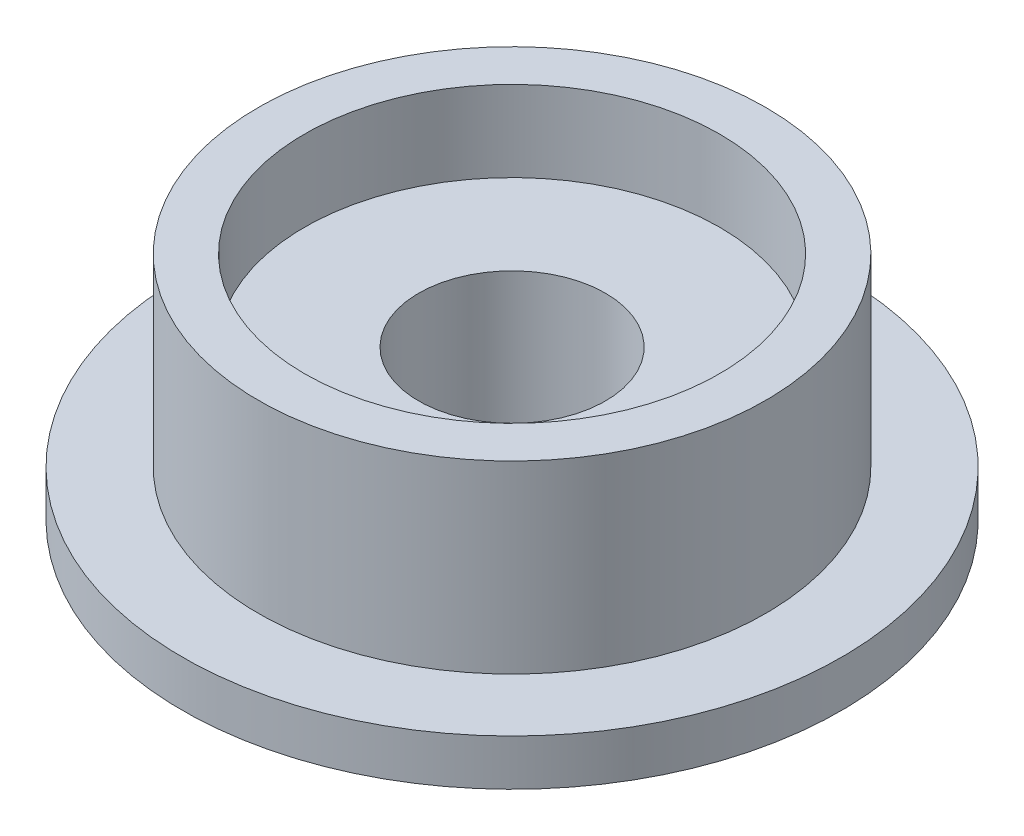
ISO-10303-21;
HEADER;
FILE_DESCRIPTION(('STEP AP214'),'2;1');
FILE_NAME('part.step','',(''),(''),'','','');
FILE_SCHEMA(('AUTOMOTIVE_DESIGN { 1 0 10303 214 1 1 1 1 }'));
ENDSEC;
DATA;
#1=APPLICATION_CONTEXT('core data for automotive mechanical design processes');
#2=APPLICATION_PROTOCOL_DEFINITION('international standard','automotive_design',2000,#1);
#3=PRODUCT_CONTEXT('',#1,'mechanical');
#4=PRODUCT('Part','Part','',(#3));
#5=PRODUCT_RELATED_PRODUCT_CATEGORY('part','',(#4));
#6=PRODUCT_DEFINITION_FORMATION('','',#4);
#7=PRODUCT_DEFINITION_CONTEXT('part definition',#1,'design');
#8=PRODUCT_DEFINITION('design','',#6,#7);
#9=PRODUCT_DEFINITION_SHAPE('','',#8);
#10=(LENGTH_UNIT() NAMED_UNIT(*) SI_UNIT(.MILLI.,.METRE.));
#11=(NAMED_UNIT(*) PLANE_ANGLE_UNIT() SI_UNIT($,.RADIAN.));
#12=(NAMED_UNIT(*) SI_UNIT($,.STERADIAN.) SOLID_ANGLE_UNIT());
#13=UNCERTAINTY_MEASURE_WITH_UNIT(LENGTH_MEASURE(1.E-05),#10,'distance_accuracy_value','');
#14=(GEOMETRIC_REPRESENTATION_CONTEXT(3) GLOBAL_UNCERTAINTY_ASSIGNED_CONTEXT((#13)) GLOBAL_UNIT_ASSIGNED_CONTEXT((#10,
#11,#12)) REPRESENTATION_CONTEXT('',''));
#15=CARTESIAN_POINT('',(0.,0.,0.));
#16=DIRECTION('',(0.,0.,1.));
#17=DIRECTION('',(1.,0.,0.));
#18=AXIS2_PLACEMENT_3D('',#15,#16,#17);
#19=CARTESIAN_POINT('',(4.05,0.,0.));
#20=DIRECTION('',(0.,-1.,0.));
#21=DIRECTION('',(0.,0.,-1.));
#22=AXIS2_PLACEMENT_3D('',#19,#20,#21);
#23=PLANE('',#22);
#24=CARTESIAN_POINT('',(0.,0.,0.));
#25=DIRECTION('',(0.,-1.,0.));
#26=DIRECTION('',(0.,0.,-1.));
#27=AXIS2_PLACEMENT_3D('',#24,#25,#26);
#28=CIRCLE('',#27,14.2875);
#29=CARTESIAN_POINT('',(0.,0.,-14.2875));
#30=VERTEX_POINT('',#29);
#31=EDGE_CURVE('E59',#30,#30,#28,.T.);
#32=ORIENTED_EDGE('',*,*,#31,.T.);
#33=EDGE_LOOP('',(#32));
#34=FACE_BOUND('',#33,.T.);
#35=CARTESIAN_POINT('',(0.,0.,0.));
#36=DIRECTION('',(0.,-1.,0.));
#37=DIRECTION('',(0.,0.,-1.));
#38=AXIS2_PLACEMENT_3D('',#35,#36,#37);
#39=CIRCLE('',#38,4.05);
#40=CARTESIAN_POINT('',(0.,0.,-4.05));
#41=VERTEX_POINT('',#40);
#42=EDGE_CURVE('E10',#41,#41,#39,.T.);
#43=ORIENTED_EDGE('',*,*,#42,.F.);
#44=EDGE_LOOP('',(#43));
#45=FACE_BOUND('',#44,.T.);
#46=ADVANCED_FACE('F31',(#34,#45),#23,.T.);
#47=CARTESIAN_POINT('',(0.,0.,0.));
#48=DIRECTION('',(0.,-1.,0.));
#49=DIRECTION('',(0.,0.,-1.));
#50=AXIS2_PLACEMENT_3D('',#47,#48,#49);
#51=CYLINDRICAL_SURFACE('',#50,4.05);
#52=ORIENTED_EDGE('',*,*,#42,.T.);
#53=EDGE_LOOP('',(#52));
#54=FACE_BOUND('',#53,.T.);
#55=CARTESIAN_POINT('',(0.,6.5,0.));
#56=DIRECTION('',(0.,-1.,0.));
#57=DIRECTION('',(0.,0.,-1.));
#58=AXIS2_PLACEMENT_3D('',#55,#56,#57);
#59=CIRCLE('',#58,4.05);
#60=CARTESIAN_POINT('',(0.,6.5,-4.05));
#61=VERTEX_POINT('',#60);
#62=EDGE_CURVE('E37',#61,#61,#59,.T.);
#63=ORIENTED_EDGE('',*,*,#62,.F.);
#64=EDGE_LOOP('',(#63));
#65=FACE_BOUND('',#64,.T.);
#66=ADVANCED_FACE('F77',(#54,#65),#51,.F.);
#67=CARTESIAN_POINT('',(4.05,6.5,0.));
#68=DIRECTION('',(0.,1.,0.));
#69=DIRECTION('',(0.,0.,1.));
#70=AXIS2_PLACEMENT_3D('',#67,#68,#69);
#71=PLANE('',#70);
#72=ORIENTED_EDGE('',*,*,#62,.T.);
#73=EDGE_LOOP('',(#72));
#74=FACE_BOUND('',#73,.T.);
#75=CARTESIAN_POINT('',(0.,6.5,0.));
#76=DIRECTION('',(0.,-1.,0.));
#77=DIRECTION('',(0.,0.,-1.));
#78=AXIS2_PLACEMENT_3D('',#75,#76,#77);
#79=CIRCLE('',#78,9.);
#80=CARTESIAN_POINT('',(0.,6.5,-9.));
#81=VERTEX_POINT('',#80);
#82=EDGE_CURVE('E41',#81,#81,#79,.T.);
#83=ORIENTED_EDGE('',*,*,#82,.F.);
#84=EDGE_LOOP('',(#83));
#85=FACE_BOUND('',#84,.T.);
#86=ADVANCED_FACE('F81',(#74,#85),#71,.T.);
#87=CARTESIAN_POINT('',(0.,0.,0.));
#88=DIRECTION('',(0.,-1.,0.));
#89=DIRECTION('',(0.,0.,-1.));
#90=AXIS2_PLACEMENT_3D('',#87,#88,#89);
#91=CYLINDRICAL_SURFACE('',#90,9.);
#92=ORIENTED_EDGE('',*,*,#82,.T.);
#93=EDGE_LOOP('',(#92));
#94=FACE_BOUND('',#93,.T.);
#95=CARTESIAN_POINT('',(0.,10.,0.));
#96=DIRECTION('',(0.,-1.,0.));
#97=DIRECTION('',(0.,0.,-1.));
#98=AXIS2_PLACEMENT_3D('',#95,#96,#97);
#99=CIRCLE('',#98,9.);
#100=CARTESIAN_POINT('',(0.,10.,-9.));
#101=VERTEX_POINT('',#100);
#102=EDGE_CURVE('E45',#101,#101,#99,.T.);
#103=ORIENTED_EDGE('',*,*,#102,.F.);
#104=EDGE_LOOP('',(#103));
#105=FACE_BOUND('',#104,.T.);
#106=ADVANCED_FACE('F85',(#94,#105),#91,.F.);
#107=CARTESIAN_POINT('',(9.,10.,0.));
#108=DIRECTION('',(0.,1.,0.));
#109=DIRECTION('',(0.,0.,1.));
#110=AXIS2_PLACEMENT_3D('',#107,#108,#109);
#111=PLANE('',#110);
#112=ORIENTED_EDGE('',*,*,#102,.T.);
#113=EDGE_LOOP('',(#112));
#114=FACE_BOUND('',#113,.T.);
#115=CARTESIAN_POINT('',(0.,10.,0.));
#116=DIRECTION('',(0.,-1.,0.));
#117=DIRECTION('',(0.,0.,-1.));
#118=AXIS2_PLACEMENT_3D('',#115,#116,#117);
#119=CIRCLE('',#118,11.);
#120=CARTESIAN_POINT('',(0.,10.,-11.));
#121=VERTEX_POINT('',#120);
#122=EDGE_CURVE('E50',#121,#121,#119,.T.);
#123=ORIENTED_EDGE('',*,*,#122,.F.);
#124=EDGE_LOOP('',(#123));
#125=FACE_BOUND('',#124,.T.);
#126=ADVANCED_FACE('F91',(#114,#125),#111,.T.);
#127=CARTESIAN_POINT('',(0.,0.,0.));
#128=DIRECTION('',(0.,-1.,0.));
#129=DIRECTION('',(0.,0.,-1.));
#130=AXIS2_PLACEMENT_3D('',#127,#128,#129);
#131=CYLINDRICAL_SURFACE('',#130,11.);
#132=ORIENTED_EDGE('',*,*,#122,.T.);
#133=EDGE_LOOP('',(#132));
#134=FACE_BOUND('',#133,.T.);
#135=CARTESIAN_POINT('',(0.,2.,0.));
#136=DIRECTION('',(0.,-1.,0.));
#137=DIRECTION('',(0.,0.,-1.));
#138=AXIS2_PLACEMENT_3D('',#135,#136,#137);
#139=CIRCLE('',#138,11.);
#140=CARTESIAN_POINT('',(0.,2.,-11.));
#141=VERTEX_POINT('',#140);
#142=EDGE_CURVE('E53',#141,#141,#139,.T.);
#143=ORIENTED_EDGE('',*,*,#142,.F.);
#144=EDGE_LOOP('',(#143));
#145=FACE_BOUND('',#144,.T.);
#146=ADVANCED_FACE('F73',(#134,#145),#131,.T.);
#147=CARTESIAN_POINT('',(11.,2.,0.));
#148=DIRECTION('',(0.,1.,0.));
#149=DIRECTION('',(0.,0.,1.));
#150=AXIS2_PLACEMENT_3D('',#147,#148,#149);
#151=PLANE('',#150);
#152=ORIENTED_EDGE('',*,*,#142,.T.);
#153=EDGE_LOOP('',(#152));
#154=FACE_BOUND('',#153,.T.);
#155=CARTESIAN_POINT('',(0.,2.,0.));
#156=DIRECTION('',(0.,-1.,0.));
#157=DIRECTION('',(0.,0.,-1.));
#158=AXIS2_PLACEMENT_3D('',#155,#156,#157);
#159=CIRCLE('',#158,14.2875);
#160=CARTESIAN_POINT('',(0.,2.,-14.2875));
#161=VERTEX_POINT('',#160);
#162=EDGE_CURVE('E56',#161,#161,#159,.T.);
#163=ORIENTED_EDGE('',*,*,#162,.F.);
#164=EDGE_LOOP('',(#163));
#165=FACE_BOUND('',#164,.T.);
#166=ADVANCED_FACE('F67',(#154,#165),#151,.T.);
#167=CARTESIAN_POINT('',(0.,0.,0.));
#168=DIRECTION('',(0.,-1.,0.));
#169=DIRECTION('',(0.,0.,-1.));
#170=AXIS2_PLACEMENT_3D('',#167,#168,#169);
#171=CYLINDRICAL_SURFACE('',#170,14.2875);
#172=ORIENTED_EDGE('',*,*,#162,.T.);
#173=EDGE_LOOP('',(#172));
#174=FACE_BOUND('',#173,.T.);
#175=ORIENTED_EDGE('',*,*,#31,.F.);
#176=EDGE_LOOP('',(#175));
#177=FACE_BOUND('',#176,.T.);
#178=ADVANCED_FACE('F65',(#174,#177),#171,.T.);
#179=CLOSED_SHELL('',(#46,#66,#86,#106,#126,#146,#166,#178));
#180=MANIFOLD_SOLID_BREP('B2',#179);
#181=ADVANCED_BREP_SHAPE_REPRESENTATION('',(#18,#180),#14);
#182=SHAPE_DEFINITION_REPRESENTATION(#9,#181);
ENDSEC;
END-ISO-10303-21;
